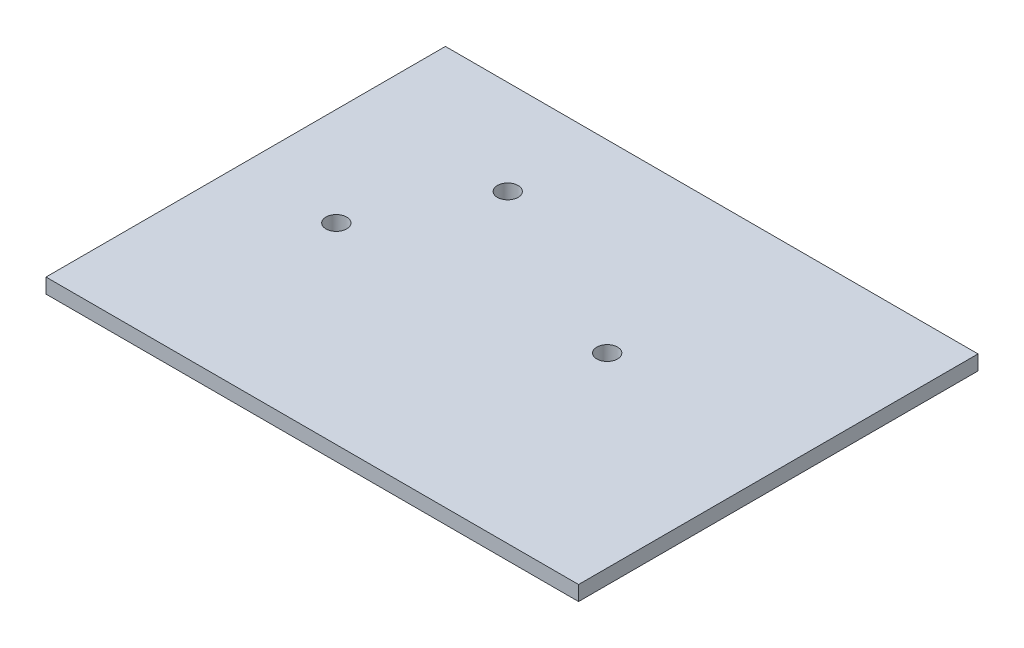
ISO-10303-21;
HEADER;
FILE_DESCRIPTION(('STEP AP214'),'2;1');
FILE_NAME('part.step','',(''),(''),'','','');
FILE_SCHEMA(('AUTOMOTIVE_DESIGN { 1 0 10303 214 1 1 1 1 }'));
ENDSEC;
DATA;
#1=APPLICATION_CONTEXT('core data for automotive mechanical design processes');
#2=APPLICATION_PROTOCOL_DEFINITION('international standard','automotive_design',2000,#1);
#3=PRODUCT_CONTEXT('',#1,'mechanical');
#4=PRODUCT('Part','Part','',(#3));
#5=PRODUCT_RELATED_PRODUCT_CATEGORY('part','',(#4));
#6=PRODUCT_DEFINITION_FORMATION('','',#4);
#7=PRODUCT_DEFINITION_CONTEXT('part definition',#1,'design');
#8=PRODUCT_DEFINITION('design','',#6,#7);
#9=PRODUCT_DEFINITION_SHAPE('','',#8);
#10=(LENGTH_UNIT() NAMED_UNIT(*) SI_UNIT(.MILLI.,.METRE.));
#11=(NAMED_UNIT(*) PLANE_ANGLE_UNIT() SI_UNIT($,.RADIAN.));
#12=(NAMED_UNIT(*) SI_UNIT($,.STERADIAN.) SOLID_ANGLE_UNIT());
#13=UNCERTAINTY_MEASURE_WITH_UNIT(LENGTH_MEASURE(1.E-05),#10,'distance_accuracy_value','');
#14=(GEOMETRIC_REPRESENTATION_CONTEXT(3) GLOBAL_UNCERTAINTY_ASSIGNED_CONTEXT((#13)) GLOBAL_UNIT_ASSIGNED_CONTEXT((#10,
#11,#12)) REPRESENTATION_CONTEXT('',''));
#15=CARTESIAN_POINT('',(0.,0.,0.));
#16=DIRECTION('',(0.,0.,1.));
#17=DIRECTION('',(1.,0.,0.));
#18=AXIS2_PLACEMENT_3D('',#15,#16,#17);
#19=CARTESIAN_POINT('',(0.,5.,0.));
#20=DIRECTION('',(1.,0.,0.));
#21=DIRECTION('',(0.,0.,-1.));
#22=AXIS2_PLACEMENT_3D('',#19,#20,#21);
#23=PLANE('',#22);
#24=DIRECTION('',(0.,0.,1.));
#25=VECTOR('',#24,1.);
#26=CARTESIAN_POINT('',(0.,0.,0.));
#27=LINE('',#26,#25);
#28=CARTESIAN_POINT('',(0.,0.,-135.));
#29=VERTEX_POINT('',#28);
#30=CARTESIAN_POINT('',(0.,0.,0.));
#31=VERTEX_POINT('',#30);
#32=EDGE_CURVE('E97',#29,#31,#27,.T.);
#33=ORIENTED_EDGE('',*,*,#32,.T.);
#34=DIRECTION('',(0.,-1.,0.));
#35=VECTOR('',#34,1.);
#36=CARTESIAN_POINT('',(0.,5.,0.));
#37=LINE('',#36,#35);
#38=CARTESIAN_POINT('',(0.,5.,0.));
#39=VERTEX_POINT('',#38);
#40=EDGE_CURVE('E12',#39,#31,#37,.T.);
#41=ORIENTED_EDGE('',*,*,#40,.F.);
#42=DIRECTION('',(0.,0.,1.));
#43=VECTOR('',#42,1.);
#44=CARTESIAN_POINT('',(0.,5.,0.));
#45=LINE('',#44,#43);
#46=CARTESIAN_POINT('',(0.,5.,-135.));
#47=VERTEX_POINT('',#46);
#48=EDGE_CURVE('E85',#47,#39,#45,.T.);
#49=ORIENTED_EDGE('',*,*,#48,.F.);
#50=DIRECTION('',(0.,-1.,0.));
#51=VECTOR('',#50,1.);
#52=CARTESIAN_POINT('',(0.,5.,-135.));
#53=LINE('',#52,#51);
#54=EDGE_CURVE('E93',#47,#29,#53,.T.);
#55=ORIENTED_EDGE('',*,*,#54,.T.);
#56=EDGE_LOOP('',(#33,#41,#49,#55));
#57=FACE_BOUND('',#56,.T.);
#58=ADVANCED_FACE('F34',(#57),#23,.F.);
#59=CARTESIAN_POINT('',(0.,5.,0.));
#60=DIRECTION('',(0.,0.,-1.));
#61=DIRECTION('',(-1.,0.,0.));
#62=AXIS2_PLACEMENT_3D('',#59,#60,#61);
#63=PLANE('',#62);
#64=DIRECTION('',(1.,0.,0.));
#65=VECTOR('',#64,1.);
#66=CARTESIAN_POINT('',(0.,0.,0.));
#67=LINE('',#66,#65);
#68=CARTESIAN_POINT('',(180.,0.,0.));
#69=VERTEX_POINT('',#68);
#70=EDGE_CURVE('E89',#31,#69,#67,.T.);
#71=ORIENTED_EDGE('',*,*,#70,.T.);
#72=DIRECTION('',(0.,-1.,0.));
#73=VECTOR('',#72,1.);
#74=CARTESIAN_POINT('',(180.,5.,0.));
#75=LINE('',#74,#73);
#76=CARTESIAN_POINT('',(180.,5.,0.));
#77=VERTEX_POINT('',#76);
#78=EDGE_CURVE('E42',#77,#69,#75,.T.);
#79=ORIENTED_EDGE('',*,*,#78,.F.);
#80=DIRECTION('',(1.,0.,0.));
#81=VECTOR('',#80,1.);
#82=CARTESIAN_POINT('',(0.,5.,0.));
#83=LINE('',#82,#81);
#84=EDGE_CURVE('E80',#39,#77,#83,.T.);
#85=ORIENTED_EDGE('',*,*,#84,.F.);
#86=ORIENTED_EDGE('',*,*,#40,.T.);
#87=EDGE_LOOP('',(#71,#79,#85,#86));
#88=FACE_BOUND('',#87,.T.);
#89=ADVANCED_FACE('F88',(#88),#63,.F.);
#90=CARTESIAN_POINT('',(180.,5.,0.));
#91=DIRECTION('',(-1.,0.,0.));
#92=DIRECTION('',(0.,0.,1.));
#93=AXIS2_PLACEMENT_3D('',#90,#91,#92);
#94=PLANE('',#93);
#95=DIRECTION('',(0.,0.,-1.));
#96=VECTOR('',#95,1.);
#97=CARTESIAN_POINT('',(180.,0.,0.));
#98=LINE('',#97,#96);
#99=CARTESIAN_POINT('',(180.,0.,-135.));
#100=VERTEX_POINT('',#99);
#101=EDGE_CURVE('E67',#69,#100,#98,.T.);
#102=ORIENTED_EDGE('',*,*,#101,.T.);
#103=DIRECTION('',(0.,-1.,0.));
#104=VECTOR('',#103,1.);
#105=CARTESIAN_POINT('',(180.,5.,-135.));
#106=LINE('',#105,#104);
#107=CARTESIAN_POINT('',(180.,5.,-135.));
#108=VERTEX_POINT('',#107);
#109=EDGE_CURVE('E90',#108,#100,#106,.T.);
#110=ORIENTED_EDGE('',*,*,#109,.F.);
#111=DIRECTION('',(0.,0.,-1.));
#112=VECTOR('',#111,1.);
#113=CARTESIAN_POINT('',(180.,5.,0.));
#114=LINE('',#113,#112);
#115=EDGE_CURVE('E83',#77,#108,#114,.T.);
#116=ORIENTED_EDGE('',*,*,#115,.F.);
#117=ORIENTED_EDGE('',*,*,#78,.T.);
#118=EDGE_LOOP('',(#102,#110,#116,#117));
#119=FACE_BOUND('',#118,.T.);
#120=ADVANCED_FACE('F91',(#119),#94,.F.);
#121=CARTESIAN_POINT('',(0.,5.,-135.));
#122=DIRECTION('',(0.,0.,1.));
#123=DIRECTION('',(1.,0.,0.));
#124=AXIS2_PLACEMENT_3D('',#121,#122,#123);
#125=PLANE('',#124);
#126=DIRECTION('',(-1.,0.,0.));
#127=VECTOR('',#126,1.);
#128=CARTESIAN_POINT('',(0.,0.,-135.));
#129=LINE('',#128,#127);
#130=EDGE_CURVE('E73',#100,#29,#129,.T.);
#131=ORIENTED_EDGE('',*,*,#130,.T.);
#132=ORIENTED_EDGE('',*,*,#54,.F.);
#133=DIRECTION('',(-1.,0.,0.));
#134=VECTOR('',#133,1.);
#135=CARTESIAN_POINT('',(0.,5.,-135.));
#136=LINE('',#135,#134);
#137=EDGE_CURVE('E50',#108,#47,#136,.T.);
#138=ORIENTED_EDGE('',*,*,#137,.F.);
#139=ORIENTED_EDGE('',*,*,#109,.T.);
#140=EDGE_LOOP('',(#131,#132,#138,#139));
#141=FACE_BOUND('',#140,.T.);
#142=ADVANCED_FACE('F105',(#141),#125,.F.);
#143=CARTESIAN_POINT('',(0.,5.,0.));
#144=DIRECTION('',(0.,-1.,0.));
#145=DIRECTION('',(0.,0.,-1.));
#146=AXIS2_PLACEMENT_3D('',#143,#144,#145);
#147=PLANE('',#146);
#148=CARTESIAN_POINT('',(33.2370753384132,5.,-64.8817410519883));
#149=DIRECTION('',(0.,1.,0.));
#150=DIRECTION('',(0.,0.,1.));
#151=AXIS2_PLACEMENT_3D('',#148,#149,#150);
#152=CIRCLE('',#151,3.5);
#153=CARTESIAN_POINT('',(33.2370753384132,5.,-61.3817410519883));
#154=VERTEX_POINT('',#153);
#155=EDGE_CURVE('E123',#154,#154,#152,.T.);
#156=ORIENTED_EDGE('',*,*,#155,.F.);
#157=EDGE_LOOP('',(#156));
#158=FACE_BOUND('',#157,.T.);
#159=CARTESIAN_POINT('',(117.085590551571,5.,-72.5847644616905));
#160=DIRECTION('',(0.,1.,0.));
#161=DIRECTION('',(0.,0.,1.));
#162=AXIS2_PLACEMENT_3D('',#159,#160,#161);
#163=CIRCLE('',#162,3.49999999999999);
#164=CARTESIAN_POINT('',(117.085590551571,5.,-69.0847644616906));
#165=VERTEX_POINT('',#164);
#166=EDGE_CURVE('E117',#165,#165,#163,.T.);
#167=ORIENTED_EDGE('',*,*,#166,.F.);
#168=EDGE_LOOP('',(#167));
#169=FACE_BOUND('',#168,.T.);
#170=CARTESIAN_POINT('',(52.9710721952661,5.,-103.086051908928));
#171=DIRECTION('',(0.,1.,0.));
#172=DIRECTION('',(0.,0.,1.));
#173=AXIS2_PLACEMENT_3D('',#170,#171,#172);
#174=CIRCLE('',#173,3.5);
#175=CARTESIAN_POINT('',(52.9710721952661,5.,-99.5860519089285));
#176=VERTEX_POINT('',#175);
#177=EDGE_CURVE('E111',#176,#176,#174,.T.);
#178=ORIENTED_EDGE('',*,*,#177,.F.);
#179=EDGE_LOOP('',(#178));
#180=FACE_BOUND('',#179,.T.);
#181=ORIENTED_EDGE('',*,*,#48,.T.);
#182=ORIENTED_EDGE('',*,*,#84,.T.);
#183=ORIENTED_EDGE('',*,*,#115,.T.);
#184=ORIENTED_EDGE('',*,*,#137,.T.);
#185=EDGE_LOOP('',(#181,#182,#183,#184));
#186=FACE_BOUND('',#185,.T.);
#187=ADVANCED_FACE('F81',(#158,#169,#180,#186),#147,.F.);
#188=CARTESIAN_POINT('',(0.,0.,0.));
#189=DIRECTION('',(0.,-1.,0.));
#190=DIRECTION('',(0.,0.,-1.));
#191=AXIS2_PLACEMENT_3D('',#188,#189,#190);
#192=PLANE('',#191);
#193=CARTESIAN_POINT('',(33.2370753384132,0.,-64.8817410519883));
#194=DIRECTION('',(0.,1.,0.));
#195=DIRECTION('',(0.,0.,1.));
#196=AXIS2_PLACEMENT_3D('',#193,#194,#195);
#197=CIRCLE('',#196,3.5);
#198=CARTESIAN_POINT('',(33.2370753384132,0.,-61.3817410519883));
#199=VERTEX_POINT('',#198);
#200=EDGE_CURVE('E120',#199,#199,#197,.T.);
#201=ORIENTED_EDGE('',*,*,#200,.T.);
#202=EDGE_LOOP('',(#201));
#203=FACE_BOUND('',#202,.T.);
#204=CARTESIAN_POINT('',(117.085590551571,0.,-72.5847644616905));
#205=DIRECTION('',(0.,1.,0.));
#206=DIRECTION('',(0.,0.,1.));
#207=AXIS2_PLACEMENT_3D('',#204,#205,#206);
#208=CIRCLE('',#207,3.49999999999999);
#209=CARTESIAN_POINT('',(117.085590551571,0.,-69.0847644616906));
#210=VERTEX_POINT('',#209);
#211=EDGE_CURVE('E114',#210,#210,#208,.T.);
#212=ORIENTED_EDGE('',*,*,#211,.T.);
#213=EDGE_LOOP('',(#212));
#214=FACE_BOUND('',#213,.T.);
#215=CARTESIAN_POINT('',(52.9710721952661,0.,-103.086051908928));
#216=DIRECTION('',(0.,1.,0.));
#217=DIRECTION('',(0.,0.,1.));
#218=AXIS2_PLACEMENT_3D('',#215,#216,#217);
#219=CIRCLE('',#218,3.5);
#220=CARTESIAN_POINT('',(52.9710721952661,0.,-99.5860519089285));
#221=VERTEX_POINT('',#220);
#222=EDGE_CURVE('E100',#221,#221,#219,.T.);
#223=ORIENTED_EDGE('',*,*,#222,.T.);
#224=EDGE_LOOP('',(#223));
#225=FACE_BOUND('',#224,.T.);
#226=ORIENTED_EDGE('',*,*,#32,.F.);
#227=ORIENTED_EDGE('',*,*,#130,.F.);
#228=ORIENTED_EDGE('',*,*,#101,.F.);
#229=ORIENTED_EDGE('',*,*,#70,.F.);
#230=EDGE_LOOP('',(#226,#227,#228,#229));
#231=FACE_BOUND('',#230,.T.);
#232=ADVANCED_FACE('F108',(#203,#214,#225,#231),#192,.T.);
#233=CARTESIAN_POINT('',(52.9710721952661,0.,-103.086051908928));
#234=DIRECTION('',(0.,1.,0.));
#235=DIRECTION('',(0.,0.,1.));
#236=AXIS2_PLACEMENT_3D('',#233,#234,#235);
#237=CYLINDRICAL_SURFACE('',#236,3.5);
#238=ORIENTED_EDGE('',*,*,#222,.F.);
#239=EDGE_LOOP('',(#238));
#240=FACE_BOUND('',#239,.T.);
#241=ORIENTED_EDGE('',*,*,#177,.T.);
#242=EDGE_LOOP('',(#241));
#243=FACE_BOUND('',#242,.T.);
#244=ADVANCED_FACE('F145',(#240,#243),#237,.F.);
#245=CARTESIAN_POINT('',(117.085590551571,0.,-72.5847644616905));
#246=DIRECTION('',(0.,1.,0.));
#247=DIRECTION('',(0.,0.,1.));
#248=AXIS2_PLACEMENT_3D('',#245,#246,#247);
#249=CYLINDRICAL_SURFACE('',#248,3.49999999999999);
#250=ORIENTED_EDGE('',*,*,#211,.F.);
#251=EDGE_LOOP('',(#250));
#252=FACE_BOUND('',#251,.T.);
#253=ORIENTED_EDGE('',*,*,#166,.T.);
#254=EDGE_LOOP('',(#253));
#255=FACE_BOUND('',#254,.T.);
#256=ADVANCED_FACE('F134',(#252,#255),#249,.F.);
#257=CARTESIAN_POINT('',(33.2370753384132,0.,-64.8817410519883));
#258=DIRECTION('',(0.,1.,0.));
#259=DIRECTION('',(0.,0.,1.));
#260=AXIS2_PLACEMENT_3D('',#257,#258,#259);
#261=CYLINDRICAL_SURFACE('',#260,3.5);
#262=ORIENTED_EDGE('',*,*,#200,.F.);
#263=EDGE_LOOP('',(#262));
#264=FACE_BOUND('',#263,.T.);
#265=ORIENTED_EDGE('',*,*,#155,.T.);
#266=EDGE_LOOP('',(#265));
#267=FACE_BOUND('',#266,.T.);
#268=ADVANCED_FACE('F131',(#264,#267),#261,.F.);
#269=CLOSED_SHELL('',(#58,#89,#120,#142,#187,#232,#244,#256,#268));
#270=MANIFOLD_SOLID_BREP('B2',#269);
#271=ADVANCED_BREP_SHAPE_REPRESENTATION('',(#18,#270),#14);
#272=SHAPE_DEFINITION_REPRESENTATION(#9,#271);
ENDSEC;
END-ISO-10303-21;
